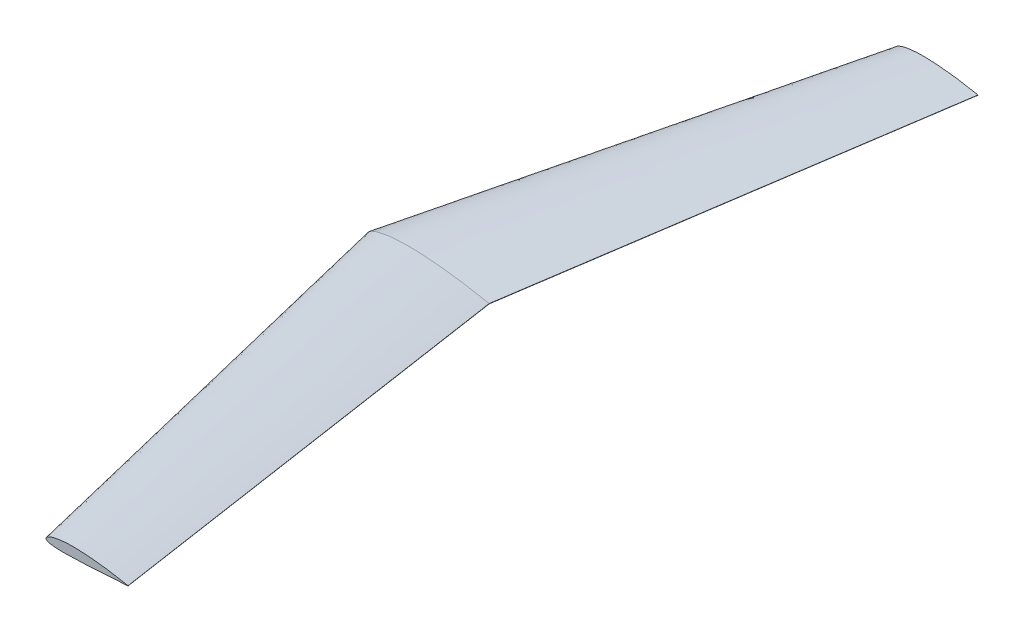
ISO-10303-21;
HEADER;
FILE_DESCRIPTION(('STEP AP214'),'2;1');
FILE_NAME('part.step','',(''),(''),'','','');
FILE_SCHEMA(('AUTOMOTIVE_DESIGN { 1 0 10303 214 1 1 1 1 }'));
ENDSEC;
DATA;
#1=APPLICATION_CONTEXT('core data for automotive mechanical design processes');
#2=APPLICATION_PROTOCOL_DEFINITION('international standard','automotive_design',2000,#1);
#3=PRODUCT_CONTEXT('',#1,'mechanical');
#4=PRODUCT('Part','Part','',(#3));
#5=PRODUCT_RELATED_PRODUCT_CATEGORY('part','',(#4));
#6=PRODUCT_DEFINITION_FORMATION('','',#4);
#7=PRODUCT_DEFINITION_CONTEXT('part definition',#1,'design');
#8=PRODUCT_DEFINITION('design','',#6,#7);
#9=PRODUCT_DEFINITION_SHAPE('','',#8);
#10=(LENGTH_UNIT() NAMED_UNIT(*) SI_UNIT(.MILLI.,.METRE.));
#11=(NAMED_UNIT(*) PLANE_ANGLE_UNIT() SI_UNIT($,.RADIAN.));
#12=(NAMED_UNIT(*) SI_UNIT($,.STERADIAN.) SOLID_ANGLE_UNIT());
#13=UNCERTAINTY_MEASURE_WITH_UNIT(LENGTH_MEASURE(1.E-05),#10,'distance_accuracy_value','');
#14=(GEOMETRIC_REPRESENTATION_CONTEXT(3) GLOBAL_UNCERTAINTY_ASSIGNED_CONTEXT((#13)) GLOBAL_UNIT_ASSIGNED_CONTEXT((#10,
#11,#12)) REPRESENTATION_CONTEXT('',''));
#15=CARTESIAN_POINT('',(0.,0.,0.));
#16=DIRECTION('',(0.,0.,1.));
#17=DIRECTION('',(1.,0.,0.));
#18=AXIS2_PLACEMENT_3D('',#15,#16,#17);
#19=CARTESIAN_POINT('',(28.3264907833071,-1.22539145258576,0.0322826882336781));
#20=CARTESIAN_POINT('',(80.8986016919539,-1.17966750041598,350.032282688234));
#21=CARTESIAN_POINT('',(21.6886364420901,0.134795638873729,0.0322826882336781));
#22=CARTESIAN_POINT('',(76.4123314795273,-0.260369408282414,350.032282688234));
#23=CARTESIAN_POINT('',(8.40003793276554,2.53152516908772,0.0322826882336781));
#24=CARTESIAN_POINT('',(67.4310793168977,1.35948781453677,350.032282688234));
#25=CARTESIAN_POINT('',(-8.30285715604828,4.76311214453636,0.0322826882336781));
#26=CARTESIAN_POINT('',(56.1422355360186,2.86773154206611,350.032282688234));
#27=CARTESIAN_POINT('',(-28.311855158187,6.51199053274483,0.0322826882336781));
#28=CARTESIAN_POINT('',(42.6189240707302,4.04973111826313,350.032282688234));
#29=CARTESIAN_POINT('',(-45.9806516761856,7.08349335163225,0.0322826882336781));
#30=CARTESIAN_POINT('',(30.6772646980741,4.43598787246337,350.032282688234));
#31=CARTESIAN_POINT('',(-60.9888956335914,4.65241696533945,0.0322826882336781));
#32=CARTESIAN_POINT('',(20.5337703781017,2.79291693186794,350.032282688234));
#33=CARTESIAN_POINT('',(-66.7173365796997,2.80876389653264,0.0322826882336781));
#34=CARTESIAN_POINT('',(16.6621376698345,1.54686279758577,350.032282688234));
#35=CARTESIAN_POINT('',(-68.8536037762803,1.8632462113591,0.0322826882336781));
#36=CARTESIAN_POINT('',(15.2183169113263,0.907823793674936,350.032282688234));
#37=CARTESIAN_POINT('',(-70.6963285467341,0.716910608769796,0.0322826882336781));
#38=CARTESIAN_POINT('',(13.9728901781642,0.13305969024971,350.032282688234));
#39=CARTESIAN_POINT('',(-72.3032470808699,-1.26551430080626,0.0322826882336781));
#40=CARTESIAN_POINT('',(12.8868358023209,-1.20678498892302,350.032282688234));
#41=CARTESIAN_POINT('',(-70.634086868671,-3.00803001237331,0.0322826882336781));
#42=CARTESIAN_POINT('',(14.0149569322555,-2.3844842769214,350.032282688234));
#43=CARTESIAN_POINT('',(-68.8258298645526,-3.80277602991174,0.0322826882336781));
#44=CARTESIAN_POINT('',(15.2370882290536,-2.92162251491917,350.032282688234));
#45=CARTESIAN_POINT('',(-65.8808253627823,-4.63869091710522,0.0322826882336781));
#46=CARTESIAN_POINT('',(17.2275033982619,-3.48658520704302,350.032282688234));
#47=CARTESIAN_POINT('',(-56.7275586123595,-5.76854948543718,0.0322826882336781));
#48=CARTESIAN_POINT('',(23.4138440224953,-4.25021311732841,350.032282688234));
#49=CARTESIAN_POINT('',(-41.6708687162566,-5.56428079557138,0.0322826882336781));
#50=CARTESIAN_POINT('',(33.5900810874146,-4.11215577355907,350.032282688234));
#51=CARTESIAN_POINT('',(-24.999236442311,-4.9177288087388,0.0322826882336781));
#52=CARTESIAN_POINT('',(44.8577955352457,-3.67517617590487,350.032282688234));
#53=CARTESIAN_POINT('',(-1.66779244307134,-3.51980877881528,0.0322826882336781));
#54=CARTESIAN_POINT('',(60.6266203461095,-2.73037584326452,350.032282688234));
#55=CARTESIAN_POINT('',(14.9974612765544,-2.42602221928401,0.0322826882336781));
#56=CARTESIAN_POINT('',(71.8900237746304,-1.99112761506706,350.032282688234));
#57=CARTESIAN_POINT('',(28.3264907833071,-1.48539123288604,0.0322826882336781));
#58=CARTESIAN_POINT('',(80.8986016919539,-1.3553913427359,350.032282688234));
#59=B_SPLINE_SURFACE_WITH_KNOTS('',3,1,((#19,#20),(#21,#22),(#23,#24),(#25,#26),(#27,#28),(#29,
#30),(#31,#32),(#33,#34),(#35,#36),(#37,#38),(#39,#40),(#41,#42),(#43,#44),(#45,#46),(#47,#48),
(#49,#50),(#51,#52),(#53,#54),(#55,#56),(#57,#58)),.UNSPECIFIED.,.F.,.F.,.F.,(4,1,1,1,1,1,1,1,1,
1,1,1,1,1,1,1,1,4),(2,2),(0.,0.0996729249269685,0.198581096615965,0.247805170456832,
0.395091203654929,0.457489818915221,0.470406405435489,0.483879408669829,0.491264120322896,
0.503458853294664,0.513609129403887,0.520450990700287,0.533235387615153,0.558031884237173,
0.656174271859652,0.754320378530032,0.803437363555032,1.),(0.,1.),.UNSPECIFIED.);
#60=CARTESIAN_POINT('',(28.3264907833071,-1.22539145258576,0.0322826882336781));
#61=CARTESIAN_POINT('',(21.6886364420901,0.134795638873729,0.0322826882336781));
#62=CARTESIAN_POINT('',(8.40003793276554,2.53152516908772,0.0322826882336781));
#63=CARTESIAN_POINT('',(-8.30285715604828,4.76311214453636,0.0322826882336781));
#64=CARTESIAN_POINT('',(-28.311855158187,6.51199053274483,0.0322826882336781));
#65=CARTESIAN_POINT('',(-45.9806516761856,7.08349335163225,0.0322826882336781));
#66=CARTESIAN_POINT('',(-60.9888956335914,4.65241696533945,0.0322826882336781));
#67=CARTESIAN_POINT('',(-66.7173365796997,2.80876389653264,0.0322826882336781));
#68=CARTESIAN_POINT('',(-68.8536037762803,1.8632462113591,0.0322826882336781));
#69=CARTESIAN_POINT('',(-70.6963285467341,0.716910608769796,0.0322826882336781));
#70=CARTESIAN_POINT('',(-72.3032470808699,-1.26551430080626,0.0322826882336781));
#71=CARTESIAN_POINT('',(-70.634086868671,-3.00803001237331,0.0322826882336781));
#72=CARTESIAN_POINT('',(-68.8258298645526,-3.80277602991174,0.0322826882336781));
#73=CARTESIAN_POINT('',(-65.8808253627823,-4.63869091710522,0.0322826882336781));
#74=CARTESIAN_POINT('',(-56.7275586123595,-5.76854948543718,0.0322826882336781));
#75=CARTESIAN_POINT('',(-41.6708687162566,-5.56428079557138,0.0322826882336781));
#76=CARTESIAN_POINT('',(-24.999236442311,-4.9177288087388,0.0322826882336781));
#77=CARTESIAN_POINT('',(-1.66779244307134,-3.51980877881528,0.0322826882336781));
#78=CARTESIAN_POINT('',(14.9974612765544,-2.42602221928401,0.0322826882336781));
#79=CARTESIAN_POINT('',(28.3264907833071,-1.48539123288604,0.0322826882336781));
#80=B_SPLINE_CURVE_WITH_KNOTS('',3,(#60,#61,#62,#63,#64,#65,#66,#67,#68,#69,#70,#71,#72,#73,#74,
#75,#76,#77,#78,#79),.UNSPECIFIED.,.F.,.F.,(4,1,1,1,1,1,1,1,1,1,1,1,1,1,1,1,1,4),(0.,
0.0996729249269685,0.198581096615965,0.247805170456832,0.395091203654929,0.457489818915221,
0.470406405435489,0.483879408669829,0.491264120322896,0.503458853294664,0.513609129403887,
0.520450990700287,0.533235387615153,0.558031884237173,0.656174271859652,0.754320378530032,
0.803437363555032,1.),.UNSPECIFIED.);
#81=CARTESIAN_POINT('',(28.3264907833071,-1.22539145258576,0.0322826882336781));
#82=VERTEX_POINT('',#81);
#83=CARTESIAN_POINT('',(28.3264907833071,-1.48539123288604,0.0322826882336781));
#84=VERTEX_POINT('',#83);
#85=EDGE_CURVE('E13',#82,#84,#80,.T.);
#86=DIRECTION('',(0.148539702049672,0.000367307772422273,0.988906376761721));
#87=VECTOR('',#86,1.);
#88=CARTESIAN_POINT('',(54.6125462376305,-1.42039128781097,175.032282688234));
#89=LINE('',#88,#87);
#90=CARTESIAN_POINT('',(80.8986016919539,-1.3553913427359,350.032282688234));
#91=VERTEX_POINT('',#90);
#92=EDGE_CURVE('E134',#84,#91,#89,.T.);
#93=CARTESIAN_POINT('',(80.8986016919539,-1.17966750041598,350.032282688234));
#94=CARTESIAN_POINT('',(76.4123314795273,-0.260369408282414,350.032282688234));
#95=CARTESIAN_POINT('',(67.4310793168977,1.35948781453677,350.032282688234));
#96=CARTESIAN_POINT('',(56.1422355360186,2.86773154206611,350.032282688234));
#97=CARTESIAN_POINT('',(42.6189240707302,4.04973111826313,350.032282688234));
#98=CARTESIAN_POINT('',(30.6772646980741,4.43598787246337,350.032282688234));
#99=CARTESIAN_POINT('',(20.5337703781017,2.79291693186794,350.032282688234));
#100=CARTESIAN_POINT('',(16.6621376698345,1.54686279758577,350.032282688234));
#101=CARTESIAN_POINT('',(15.2183169113263,0.907823793674936,350.032282688234));
#102=CARTESIAN_POINT('',(13.9728901781642,0.13305969024971,350.032282688234));
#103=CARTESIAN_POINT('',(12.8868358023209,-1.20678498892302,350.032282688234));
#104=CARTESIAN_POINT('',(14.0149569322555,-2.3844842769214,350.032282688234));
#105=CARTESIAN_POINT('',(15.2370882290536,-2.92162251491917,350.032282688234));
#106=CARTESIAN_POINT('',(17.2275033982619,-3.48658520704302,350.032282688234));
#107=CARTESIAN_POINT('',(23.4138440224953,-4.25021311732841,350.032282688234));
#108=CARTESIAN_POINT('',(33.5900810874146,-4.11215577355907,350.032282688234));
#109=CARTESIAN_POINT('',(44.8577955352457,-3.67517617590487,350.032282688234));
#110=CARTESIAN_POINT('',(60.6266203461095,-2.73037584326452,350.032282688234));
#111=CARTESIAN_POINT('',(71.8900237746304,-1.99112761506706,350.032282688234));
#112=CARTESIAN_POINT('',(80.8986016919539,-1.3553913427359,350.032282688234));
#113=B_SPLINE_CURVE_WITH_KNOTS('',3,(#93,#94,#95,#96,#97,#98,#99,#100,#101,#102,#103,#104,#105,
#106,#107,#108,#109,#110,#111,#112),.UNSPECIFIED.,.F.,.F.,(4,1,1,1,1,1,1,1,1,1,1,1,1,1,1,1,1,4),
(0.,0.0996729249269685,0.198581096615965,0.247805170456832,0.395091203654929,0.457489818915221,
0.470406405435489,0.483879408669829,0.491264120322896,0.503458853294664,0.513609129403887,
0.520450990700287,0.533235387615153,0.558031884237173,0.656174271859652,0.754320378530032,
0.803437363555032,1.),.UNSPECIFIED.);
#114=CARTESIAN_POINT('',(80.8986016919539,-1.17966750041598,350.032282688234));
#115=VERTEX_POINT('',#114);
#116=EDGE_CURVE('E181',#115,#91,#113,.T.);
#117=DIRECTION('',(0.14853971083021,0.000129190601555182,0.988906435218351));
#118=VECTOR('',#117,1.);
#119=CARTESIAN_POINT('',(54.6125462376305,-1.20252947650087,175.032282688234));
#120=LINE('',#119,#118);
#121=EDGE_CURVE('E178',#82,#115,#120,.T.);
#122=ORIENTED_EDGE('',*,*,#85,.T.);
#123=ORIENTED_EDGE('',*,*,#92,.T.);
#124=ORIENTED_EDGE('',*,*,#116,.F.);
#125=ORIENTED_EDGE('',*,*,#121,.F.);
#126=EDGE_LOOP('',(#122,#123,#124,#125));
#127=FACE_BOUND('',#126,.T.);
#128=ADVANCED_FACE('F123',(#127),#59,.T.);
#129=CARTESIAN_POINT('',(28.3264907833071,-1.48539123288604,0.0322826882336781));
#130=DIRECTION('',(0.98890644347088,0.,-0.14853971206979));
#131=DIRECTION('',(0.,1.,0.));
#132=AXIS2_PLACEMENT_3D('',#129,#130,#131);
#133=PLANE('',#132);
#134=DIRECTION('',(0.,1.,0.));
#135=VECTOR('',#134,1.);
#136=CARTESIAN_POINT('',(28.3264907833071,-1.3553913427359,0.0322826882336781));
#137=LINE('',#136,#135);
#138=EDGE_CURVE('E167',#84,#82,#137,.T.);
#139=ORIENTED_EDGE('',*,*,#138,.T.);
#140=ORIENTED_EDGE('',*,*,#121,.T.);
#141=DIRECTION('',(0.,1.,0.));
#142=VECTOR('',#141,1.);
#143=CARTESIAN_POINT('',(80.8986016919539,-1.26752942157594,350.032282688234));
#144=LINE('',#143,#142);
#145=EDGE_CURVE('E127',#91,#115,#144,.T.);
#146=ORIENTED_EDGE('',*,*,#145,.F.);
#147=ORIENTED_EDGE('',*,*,#92,.F.);
#148=EDGE_LOOP('',(#139,#140,#146,#147));
#149=FACE_BOUND('',#148,.T.);
#150=ADVANCED_FACE('F125',(#149),#133,.T.);
#151=CARTESIAN_POINT('',(13.3753579705286,-0.823484762152344,350.032282688234));
#152=DIRECTION('',(0.,0.,-1.));
#153=DIRECTION('',(-1.,0.,0.));
#154=AXIS2_PLACEMENT_3D('',#151,#152,#153);
#155=PLANE('',#154);
#156=ORIENTED_EDGE('',*,*,#116,.T.);
#157=ORIENTED_EDGE('',*,*,#145,.T.);
#158=EDGE_LOOP('',(#156,#157));
#159=FACE_BOUND('',#158,.T.);
#160=ADVANCED_FACE('F221',(#159),#155,.F.);
#161=CARTESIAN_POINT('',(28.3264907833071,-1.22539145258576,0.0322826882336781));
#162=CARTESIAN_POINT('',(80.8986016919539,-1.17966750041598,-349.967717311766));
#163=CARTESIAN_POINT('',(21.6886364420901,0.134795638873729,0.0322826882336781));
#164=CARTESIAN_POINT('',(76.4123314795273,-0.260369408282414,-349.967717311766));
#165=CARTESIAN_POINT('',(8.40003793276554,2.53152516908772,0.0322826882336781));
#166=CARTESIAN_POINT('',(67.4310793168977,1.35948781453677,-349.967717311766));
#167=CARTESIAN_POINT('',(-8.30285715604828,4.76311214453636,0.0322826882336781));
#168=CARTESIAN_POINT('',(56.1422355360186,2.86773154206611,-349.967717311766));
#169=CARTESIAN_POINT('',(-28.311855158187,6.51199053274483,0.0322826882336781));
#170=CARTESIAN_POINT('',(42.6189240707302,4.04973111826313,-349.967717311766));
#171=CARTESIAN_POINT('',(-45.9806516761856,7.08349335163225,0.0322826882336781));
#172=CARTESIAN_POINT('',(30.6772646980741,4.43598787246337,-349.967717311766));
#173=CARTESIAN_POINT('',(-60.9888956335914,4.65241696533945,0.0322826882336781));
#174=CARTESIAN_POINT('',(20.5337703781017,2.79291693186794,-349.967717311766));
#175=CARTESIAN_POINT('',(-66.7173365796997,2.80876389653264,0.0322826882336781));
#176=CARTESIAN_POINT('',(16.6621376698345,1.54686279758577,-349.967717311766));
#177=CARTESIAN_POINT('',(-68.8536037762803,1.8632462113591,0.0322826882336781));
#178=CARTESIAN_POINT('',(15.2183169113263,0.907823793674936,-349.967717311766));
#179=CARTESIAN_POINT('',(-70.6963285467341,0.716910608769796,0.0322826882336781));
#180=CARTESIAN_POINT('',(13.9728901781642,0.13305969024971,-349.967717311766));
#181=CARTESIAN_POINT('',(-72.3032470808699,-1.26551430080626,0.0322826882336781));
#182=CARTESIAN_POINT('',(12.8868358023209,-1.20678498892302,-349.967717311766));
#183=CARTESIAN_POINT('',(-70.634086868671,-3.00803001237331,0.0322826882336781));
#184=CARTESIAN_POINT('',(14.0149569322555,-2.3844842769214,-349.967717311766));
#185=CARTESIAN_POINT('',(-68.8258298645526,-3.80277602991174,0.0322826882336781));
#186=CARTESIAN_POINT('',(15.2370882290536,-2.92162251491917,-349.967717311766));
#187=CARTESIAN_POINT('',(-65.8808253627823,-4.63869091710522,0.0322826882336781));
#188=CARTESIAN_POINT('',(17.2275033982619,-3.48658520704302,-349.967717311766));
#189=CARTESIAN_POINT('',(-56.7275586123595,-5.76854948543718,0.0322826882336781));
#190=CARTESIAN_POINT('',(23.4138440224953,-4.25021311732841,-349.967717311766));
#191=CARTESIAN_POINT('',(-41.6708687162566,-5.56428079557138,0.0322826882336781));
#192=CARTESIAN_POINT('',(33.5900810874146,-4.11215577355907,-349.967717311766));
#193=CARTESIAN_POINT('',(-24.999236442311,-4.9177288087388,0.0322826882336781));
#194=CARTESIAN_POINT('',(44.8577955352457,-3.67517617590487,-349.967717311766));
#195=CARTESIAN_POINT('',(-1.66779244307134,-3.51980877881528,0.0322826882336781));
#196=CARTESIAN_POINT('',(60.6266203461095,-2.73037584326452,-349.967717311766));
#197=CARTESIAN_POINT('',(14.9974612765544,-2.42602221928401,0.0322826882336781));
#198=CARTESIAN_POINT('',(71.8900237746304,-1.99112761506706,-349.967717311766));
#199=CARTESIAN_POINT('',(28.3264907833071,-1.48539123288604,0.0322826882336781));
#200=CARTESIAN_POINT('',(80.8986016919539,-1.3553913427359,-349.967717311766));
#201=B_SPLINE_SURFACE_WITH_KNOTS('',3,1,((#161,#162),(#163,#164),(#165,#166),(#167,#168),(#169,
#170),(#171,#172),(#173,#174),(#175,#176),(#177,#178),(#179,#180),(#181,#182),(#183,#184),(#185,
#186),(#187,#188),(#189,#190),(#191,#192),(#193,#194),(#195,#196),(#197,#198),(#199,#200)),
.UNSPECIFIED.,.F.,.F.,.F.,(4,1,1,1,1,1,1,1,1,1,1,1,1,1,1,1,1,4),(2,2),(0.,0.0996729249269685,
0.198581096615965,0.247805170456832,0.395091203654929,0.457489818915221,0.470406405435489,
0.483879408669829,0.491264120322896,0.503458853294664,0.513609129403887,0.520450990700287,
0.533235387615153,0.558031884237173,0.656174271859652,0.754320378530032,0.803437363555032,1.),
(0.,1.),.UNSPECIFIED.);
#202=DIRECTION('',(0.14853971083021,0.000129190601555182,-0.988906435218351));
#203=VECTOR('',#202,1.);
#204=CARTESIAN_POINT('',(54.6125462376305,-1.20252947650087,-174.967717311766));
#205=LINE('',#204,#203);
#206=CARTESIAN_POINT('',(80.8986016919539,-1.17966750041598,-349.967717311766));
#207=VERTEX_POINT('',#206);
#208=EDGE_CURVE('E164',#82,#207,#205,.T.);
#209=CARTESIAN_POINT('',(80.8986016919539,-1.17966750041598,-349.967717311766));
#210=CARTESIAN_POINT('',(76.4123314795273,-0.260369408282414,-349.967717311766));
#211=CARTESIAN_POINT('',(67.4310793168977,1.35948781453677,-349.967717311766));
#212=CARTESIAN_POINT('',(56.1422355360186,2.86773154206611,-349.967717311766));
#213=CARTESIAN_POINT('',(42.6189240707302,4.04973111826313,-349.967717311766));
#214=CARTESIAN_POINT('',(30.6772646980741,4.43598787246337,-349.967717311766));
#215=CARTESIAN_POINT('',(20.5337703781017,2.79291693186794,-349.967717311766));
#216=CARTESIAN_POINT('',(16.6621376698345,1.54686279758577,-349.967717311766));
#217=CARTESIAN_POINT('',(15.2183169113263,0.907823793674936,-349.967717311766));
#218=CARTESIAN_POINT('',(13.9728901781642,0.13305969024971,-349.967717311766));
#219=CARTESIAN_POINT('',(12.8868358023209,-1.20678498892302,-349.967717311766));
#220=CARTESIAN_POINT('',(14.0149569322555,-2.3844842769214,-349.967717311766));
#221=CARTESIAN_POINT('',(15.2370882290536,-2.92162251491917,-349.967717311766));
#222=CARTESIAN_POINT('',(17.2275033982619,-3.48658520704302,-349.967717311766));
#223=CARTESIAN_POINT('',(23.4138440224953,-4.25021311732841,-349.967717311766));
#224=CARTESIAN_POINT('',(33.5900810874146,-4.11215577355907,-349.967717311766));
#225=CARTESIAN_POINT('',(44.8577955352457,-3.67517617590487,-349.967717311766));
#226=CARTESIAN_POINT('',(60.6266203461095,-2.73037584326452,-349.967717311766));
#227=CARTESIAN_POINT('',(71.8900237746304,-1.99112761506706,-349.967717311766));
#228=CARTESIAN_POINT('',(80.8986016919539,-1.3553913427359,-349.967717311766));
#229=B_SPLINE_CURVE_WITH_KNOTS('',3,(#209,#210,#211,#212,#213,#214,#215,#216,#217,#218,#219,
#220,#221,#222,#223,#224,#225,#226,#227,#228),.UNSPECIFIED.,.F.,.F.,(4,1,1,1,1,1,1,1,1,1,1,1,1,
1,1,1,1,4),(0.,0.0996729249269685,0.198581096615965,0.247805170456832,0.395091203654929,
0.457489818915221,0.470406405435489,0.483879408669829,0.491264120322896,0.503458853294664,
0.513609129403887,0.520450990700287,0.533235387615153,0.558031884237173,0.656174271859652,
0.754320378530032,0.803437363555032,1.),.UNSPECIFIED.);
#230=CARTESIAN_POINT('',(80.8986016919539,-1.3553913427359,-349.967717311766));
#231=VERTEX_POINT('',#230);
#232=EDGE_CURVE('E169',#207,#231,#229,.T.);
#233=DIRECTION('',(0.148539702049672,0.000367307772422273,-0.988906376761721));
#234=VECTOR('',#233,1.);
#235=CARTESIAN_POINT('',(54.6125462376305,-1.42039128781097,-174.967717311766));
#236=LINE('',#235,#234);
#237=EDGE_CURVE('E142',#84,#231,#236,.T.);
#238=ORIENTED_EDGE('',*,*,#85,.F.);
#239=ORIENTED_EDGE('',*,*,#208,.T.);
#240=ORIENTED_EDGE('',*,*,#232,.T.);
#241=ORIENTED_EDGE('',*,*,#237,.F.);
#242=EDGE_LOOP('',(#238,#239,#240,#241));
#243=FACE_BOUND('',#242,.T.);
#244=ADVANCED_FACE('F171',(#243),#201,.F.);
#245=CARTESIAN_POINT('',(28.3264907833071,-1.48539123288604,0.0322826882336781));
#246=DIRECTION('',(0.98890644347088,0.,0.14853971206979));
#247=DIRECTION('',(0.,1.,0.));
#248=AXIS2_PLACEMENT_3D('',#245,#246,#247);
#249=PLANE('',#248);
#250=ORIENTED_EDGE('',*,*,#138,.F.);
#251=ORIENTED_EDGE('',*,*,#237,.T.);
#252=DIRECTION('',(0.,1.,0.));
#253=VECTOR('',#252,1.);
#254=CARTESIAN_POINT('',(80.8986016919539,-1.26752942157594,-349.967717311766));
#255=LINE('',#254,#253);
#256=EDGE_CURVE('E158',#231,#207,#255,.T.);
#257=ORIENTED_EDGE('',*,*,#256,.T.);
#258=ORIENTED_EDGE('',*,*,#208,.F.);
#259=EDGE_LOOP('',(#250,#251,#257,#258));
#260=FACE_BOUND('',#259,.T.);
#261=ADVANCED_FACE('F165',(#260),#249,.T.);
#262=CARTESIAN_POINT('',(13.3753579705286,-0.823484762152344,-349.967717311766));
#263=DIRECTION('',(0.,0.,1.));
#264=DIRECTION('',(-1.,0.,0.));
#265=AXIS2_PLACEMENT_3D('',#262,#263,#264);
#266=PLANE('',#265);
#267=ORIENTED_EDGE('',*,*,#232,.F.);
#268=ORIENTED_EDGE('',*,*,#256,.F.);
#269=EDGE_LOOP('',(#267,#268));
#270=FACE_BOUND('',#269,.T.);
#271=ADVANCED_FACE('F208',(#270),#266,.F.);
#272=CLOSED_SHELL('',(#128,#150,#160,#244,#261,#271));
#273=MANIFOLD_SOLID_BREP('B2',#272);
#274=ADVANCED_BREP_SHAPE_REPRESENTATION('',(#18,#273),#14);
#275=SHAPE_DEFINITION_REPRESENTATION(#9,#274);
ENDSEC;
END-ISO-10303-21;
